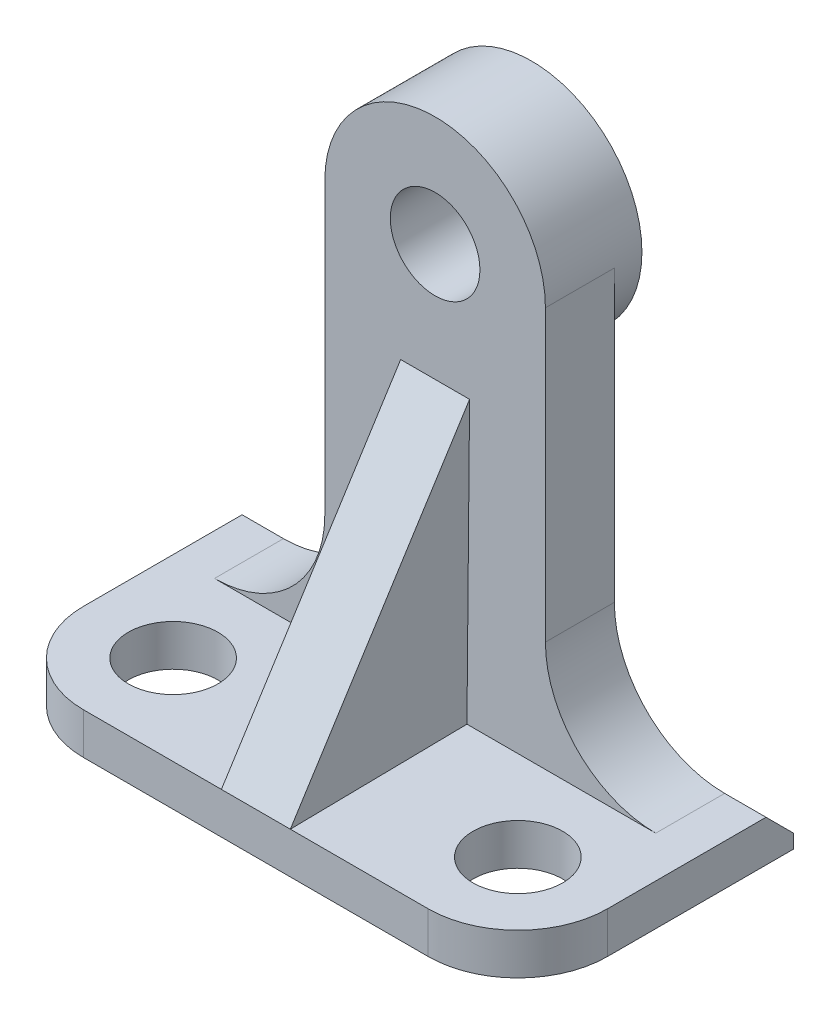
ISO-10303-21;
HEADER;
FILE_DESCRIPTION(('STEP AP214'),'2;1');
FILE_NAME('part.step','',(''),(''),'','','');
FILE_SCHEMA(('AUTOMOTIVE_DESIGN { 1 0 10303 214 1 1 1 1 }'));
ENDSEC;
DATA;
#1=APPLICATION_CONTEXT('core data for automotive mechanical design processes');
#2=APPLICATION_PROTOCOL_DEFINITION('international standard','automotive_design',2000,#1);
#3=PRODUCT_CONTEXT('',#1,'mechanical');
#4=PRODUCT('Part','Part','',(#3));
#5=PRODUCT_RELATED_PRODUCT_CATEGORY('part','',(#4));
#6=PRODUCT_DEFINITION_FORMATION('','',#4);
#7=PRODUCT_DEFINITION_CONTEXT('part definition',#1,'design');
#8=PRODUCT_DEFINITION('design','',#6,#7);
#9=PRODUCT_DEFINITION_SHAPE('','',#8);
#10=(LENGTH_UNIT() NAMED_UNIT(*) SI_UNIT(.MILLI.,.METRE.));
#11=(NAMED_UNIT(*) PLANE_ANGLE_UNIT() SI_UNIT($,.RADIAN.));
#12=(NAMED_UNIT(*) SI_UNIT($,.STERADIAN.) SOLID_ANGLE_UNIT());
#13=UNCERTAINTY_MEASURE_WITH_UNIT(LENGTH_MEASURE(1.E-05),#10,'distance_accuracy_value','');
#14=(GEOMETRIC_REPRESENTATION_CONTEXT(3) GLOBAL_UNCERTAINTY_ASSIGNED_CONTEXT((#13)) GLOBAL_UNIT_ASSIGNED_CONTEXT((#10,
#11,#12)) REPRESENTATION_CONTEXT('',''));
#15=CARTESIAN_POINT('',(0.,0.,0.));
#16=DIRECTION('',(0.,0.,1.));
#17=DIRECTION('',(1.,0.,0.));
#18=AXIS2_PLACEMENT_3D('',#15,#16,#17);
#19=CARTESIAN_POINT('',(25.,-64.,23.));
#20=DIRECTION('',(0.,1.,0.));
#21=DIRECTION('',(0.,0.,1.));
#22=AXIS2_PLACEMENT_3D('',#19,#20,#21);
#23=CYLINDRICAL_SURFACE('',#22,13.);
#24=DIRECTION('',(0.,-1.,0.));
#25=VECTOR('',#24,1.);
#26=CARTESIAN_POINT('',(38.,-64.,23.));
#27=LINE('',#26,#25);
#28=CARTESIAN_POINT('',(38.,-58.,23.));
#29=VERTEX_POINT('',#28);
#30=CARTESIAN_POINT('',(38.,-64.,23.));
#31=VERTEX_POINT('',#30);
#32=EDGE_CURVE('E291',#29,#31,#27,.T.);
#33=ORIENTED_EDGE('',*,*,#32,.F.);
#34=CARTESIAN_POINT('',(25.,-58.,23.));
#35=DIRECTION('',(0.,-1.,0.));
#36=DIRECTION('',(0.,0.,-1.));
#37=AXIS2_PLACEMENT_3D('',#34,#35,#36);
#38=CIRCLE('',#37,13.);
#39=CARTESIAN_POINT('',(25.,-58.,36.));
#40=VERTEX_POINT('',#39);
#41=EDGE_CURVE('E55',#40,#29,#38,.F.);
#42=ORIENTED_EDGE('',*,*,#41,.F.);
#43=DIRECTION('',(0.,-1.,0.));
#44=VECTOR('',#43,1.);
#45=CARTESIAN_POINT('',(25.,-64.,36.));
#46=LINE('',#45,#44);
#47=CARTESIAN_POINT('',(25.,-64.,36.));
#48=VERTEX_POINT('',#47);
#49=EDGE_CURVE('E294',#48,#40,#46,.F.);
#50=ORIENTED_EDGE('',*,*,#49,.F.);
#51=CARTESIAN_POINT('',(25.,-64.,23.));
#52=DIRECTION('',(0.,1.,0.));
#53=DIRECTION('',(0.,0.,1.));
#54=AXIS2_PLACEMENT_3D('',#51,#52,#53);
#55=CIRCLE('',#54,13.);
#56=EDGE_CURVE('E13',#31,#48,#55,.F.);
#57=ORIENTED_EDGE('',*,*,#56,.F.);
#58=EDGE_LOOP('',(#33,#42,#50,#57));
#59=FACE_BOUND('',#58,.T.);
#60=ADVANCED_FACE('F48',(#59),#23,.T.);
#61=CARTESIAN_POINT('',(-25.,-64.,23.));
#62=DIRECTION('',(0.,-1.,0.));
#63=DIRECTION('',(0.,0.,-1.));
#64=AXIS2_PLACEMENT_3D('',#61,#62,#63);
#65=CYLINDRICAL_SURFACE('',#64,13.);
#66=DIRECTION('',(0.,1.,0.));
#67=VECTOR('',#66,1.);
#68=CARTESIAN_POINT('',(-38.,-64.,23.));
#69=LINE('',#68,#67);
#70=CARTESIAN_POINT('',(-38.,-64.,23.));
#71=VERTEX_POINT('',#70);
#72=CARTESIAN_POINT('',(-38.,-58.,23.));
#73=VERTEX_POINT('',#72);
#74=EDGE_CURVE('E281',#71,#73,#69,.T.);
#75=ORIENTED_EDGE('',*,*,#74,.F.);
#76=CARTESIAN_POINT('',(-25.,-64.,23.));
#77=DIRECTION('',(0.,1.,0.));
#78=DIRECTION('',(0.,0.,1.));
#79=AXIS2_PLACEMENT_3D('',#76,#77,#78);
#80=CIRCLE('',#79,13.);
#81=CARTESIAN_POINT('',(-25.,-64.,36.));
#82=VERTEX_POINT('',#81);
#83=EDGE_CURVE('E287',#82,#71,#80,.F.);
#84=ORIENTED_EDGE('',*,*,#83,.F.);
#85=DIRECTION('',(0.,1.,0.));
#86=VECTOR('',#85,1.);
#87=CARTESIAN_POINT('',(-25.,-64.,36.));
#88=LINE('',#87,#86);
#89=CARTESIAN_POINT('',(-25.,-58.,36.));
#90=VERTEX_POINT('',#89);
#91=EDGE_CURVE('E284',#90,#82,#88,.F.);
#92=ORIENTED_EDGE('',*,*,#91,.F.);
#93=CARTESIAN_POINT('',(-25.,-58.,23.));
#94=DIRECTION('',(0.,-1.,0.));
#95=DIRECTION('',(0.,0.,-1.));
#96=AXIS2_PLACEMENT_3D('',#93,#94,#95);
#97=CIRCLE('',#96,13.);
#98=EDGE_CURVE('E289',#73,#90,#97,.F.);
#99=ORIENTED_EDGE('',*,*,#98,.F.);
#100=EDGE_LOOP('',(#75,#84,#92,#99));
#101=FACE_BOUND('',#100,.T.);
#102=ADVANCED_FACE('F368',(#101),#65,.T.);
#103=CARTESIAN_POINT('',(32.,-58.,10.));
#104=DIRECTION('',(0.,-1.,0.));
#105=DIRECTION('',(0.,0.,-1.));
#106=AXIS2_PLACEMENT_3D('',#103,#104,#105);
#107=PLANE('',#106);
#108=CARTESIAN_POINT('',(25.,-58.,23.));
#109=DIRECTION('',(0.,1.,0.));
#110=DIRECTION('',(0.,0.,1.));
#111=AXIS2_PLACEMENT_3D('',#108,#109,#110);
#112=CIRCLE('',#111,6.5);
#113=CARTESIAN_POINT('',(25.,-58.,29.5));
#114=VERTEX_POINT('',#113);
#115=EDGE_CURVE('E332',#114,#114,#112,.T.);
#116=ORIENTED_EDGE('',*,*,#115,.F.);
#117=EDGE_LOOP('',(#116));
#118=FACE_BOUND('',#117,.T.);
#119=DIRECTION('',(-1.,0.,0.));
#120=VECTOR('',#119,1.);
#121=CARTESIAN_POINT('',(38.,-58.,36.));
#122=LINE('',#121,#120);
#123=CARTESIAN_POINT('',(5.,-58.,36.));
#124=VERTEX_POINT('',#123);
#125=EDGE_CURVE('E191',#40,#124,#122,.T.);
#126=ORIENTED_EDGE('',*,*,#125,.F.);
#127=ORIENTED_EDGE('',*,*,#41,.T.);
#128=DIRECTION('',(0.,0.,-1.));
#129=VECTOR('',#128,1.);
#130=CARTESIAN_POINT('',(38.,-58.,10.));
#131=LINE('',#130,#129);
#132=CARTESIAN_POINT('',(38.,-58.,0.));
#133=VERTEX_POINT('',#132);
#134=EDGE_CURVE('E253',#29,#133,#131,.T.);
#135=ORIENTED_EDGE('',*,*,#134,.T.);
#136=DIRECTION('',(-1.,0.,0.));
#137=VECTOR('',#136,1.);
#138=CARTESIAN_POINT('',(-38.,-58.,0.));
#139=LINE('',#138,#137);
#140=CARTESIAN_POINT('',(32.,-58.,0.));
#141=VERTEX_POINT('',#140);
#142=EDGE_CURVE('E277',#133,#141,#139,.T.);
#143=ORIENTED_EDGE('',*,*,#142,.T.);
#144=DIRECTION('',(0.,0.,-1.));
#145=VECTOR('',#144,1.);
#146=CARTESIAN_POINT('',(32.,-58.,10.));
#147=LINE('',#146,#145);
#148=CARTESIAN_POINT('',(32.,-58.,10.));
#149=VERTEX_POINT('',#148);
#150=EDGE_CURVE('E250',#149,#141,#147,.T.);
#151=ORIENTED_EDGE('',*,*,#150,.F.);
#152=DIRECTION('',(1.,0.,0.));
#153=VECTOR('',#152,1.);
#154=CARTESIAN_POINT('',(0.,-58.,10.));
#155=LINE('',#154,#153);
#156=CARTESIAN_POINT('',(4.61673524619883,-58.,10.));
#157=VERTEX_POINT('',#156);
#158=EDGE_CURVE('E208',#157,#149,#155,.T.);
#159=ORIENTED_EDGE('',*,*,#158,.F.);
#160=DIRECTION('',(0.014739350757727,0.,0.999891369869368));
#161=VECTOR('',#160,1.);
#162=CARTESIAN_POINT('',(4.62268421831715,-58.,10.4035676997232));
#163=LINE('',#162,#161);
#164=EDGE_CURVE('E184',#157,#124,#163,.T.);
#165=ORIENTED_EDGE('',*,*,#164,.T.);
#166=EDGE_LOOP('',(#126,#127,#135,#143,#151,#159,#165));
#167=FACE_BOUND('',#166,.T.);
#168=ADVANCED_FACE('F297',(#118,#167),#107,.F.);
#169=CARTESIAN_POINT('',(0.,0.,10.));
#170=DIRECTION('',(0.,0.,1.));
#171=DIRECTION('',(1.,0.,0.));
#172=AXIS2_PLACEMENT_3D('',#169,#170,#171);
#173=PLANE('',#172);
#174=DIRECTION('',(0.00934751242358628,0.999956311051383,0.));
#175=VECTOR('',#174,1.);
#176=CARTESIAN_POINT('',(5.15846388874759,-0.0482209120076363,10.));
#177=LINE('',#176,#175);
#178=CARTESIAN_POINT('',(5.,-17.,10.));
#179=VERTEX_POINT('',#178);
#180=EDGE_CURVE('E169',#157,#179,#177,.T.);
#181=ORIENTED_EDGE('',*,*,#180,.F.);
#182=ORIENTED_EDGE('',*,*,#158,.T.);
#183=CARTESIAN_POINT('',(32.,-42.,10.));
#184=DIRECTION('',(0.,0.,-1.));
#185=DIRECTION('',(1.,0.,0.));
#186=AXIS2_PLACEMENT_3D('',#183,#184,#185);
#187=CIRCLE('',#186,16.);
#188=CARTESIAN_POINT('',(16.,-42.,10.));
#189=VERTEX_POINT('',#188);
#190=EDGE_CURVE('E232',#149,#189,#187,.T.);
#191=ORIENTED_EDGE('',*,*,#190,.T.);
#192=DIRECTION('',(0.,1.,0.));
#193=VECTOR('',#192,1.);
#194=CARTESIAN_POINT('',(16.,0.,10.));
#195=LINE('',#194,#193);
#196=CARTESIAN_POINT('',(16.,0.,10.));
#197=VERTEX_POINT('',#196);
#198=EDGE_CURVE('E234',#189,#197,#195,.T.);
#199=ORIENTED_EDGE('',*,*,#198,.T.);
#200=CARTESIAN_POINT('',(0.,0.,10.));
#201=DIRECTION('',(0.,0.,1.));
#202=DIRECTION('',(1.,0.,0.));
#203=AXIS2_PLACEMENT_3D('',#200,#201,#202);
#204=CIRCLE('',#203,16.);
#205=CARTESIAN_POINT('',(-16.,0.,10.));
#206=VERTEX_POINT('',#205);
#207=EDGE_CURVE('E224',#197,#206,#204,.T.);
#208=ORIENTED_EDGE('',*,*,#207,.T.);
#209=DIRECTION('',(0.,-1.,0.));
#210=VECTOR('',#209,1.);
#211=CARTESIAN_POINT('',(-16.,0.,10.));
#212=LINE('',#211,#210);
#213=CARTESIAN_POINT('',(-16.,-42.,10.));
#214=VERTEX_POINT('',#213);
#215=EDGE_CURVE('E227',#206,#214,#212,.T.);
#216=ORIENTED_EDGE('',*,*,#215,.T.);
#217=CARTESIAN_POINT('',(-32.,-42.,10.));
#218=DIRECTION('',(0.,0.,-1.));
#219=DIRECTION('',(1.,0.,0.));
#220=AXIS2_PLACEMENT_3D('',#217,#218,#219);
#221=CIRCLE('',#220,16.);
#222=CARTESIAN_POINT('',(-32.,-58.,10.));
#223=VERTEX_POINT('',#222);
#224=EDGE_CURVE('E230',#214,#223,#221,.T.);
#225=ORIENTED_EDGE('',*,*,#224,.T.);
#226=CARTESIAN_POINT('',(-4.61673524619882,-58.,10.));
#227=VERTEX_POINT('',#226);
#228=EDGE_CURVE('E183',#223,#227,#155,.T.);
#229=ORIENTED_EDGE('',*,*,#228,.T.);
#230=DIRECTION('',(-0.00934751242358628,0.999956311051383,0.));
#231=VECTOR('',#230,1.);
#232=CARTESIAN_POINT('',(-5.15846388874759,-0.0482209120076363,10.));
#233=LINE('',#232,#231);
#234=CARTESIAN_POINT('',(-5.,-17.,10.));
#235=VERTEX_POINT('',#234);
#236=EDGE_CURVE('E173',#227,#235,#233,.T.);
#237=ORIENTED_EDGE('',*,*,#236,.T.);
#238=DIRECTION('',(1.,0.,0.));
#239=VECTOR('',#238,1.);
#240=CARTESIAN_POINT('',(0.,-17.,10.));
#241=LINE('',#240,#239);
#242=EDGE_CURVE('E157',#179,#235,#241,.F.);
#243=ORIENTED_EDGE('',*,*,#242,.F.);
#244=EDGE_LOOP('',(#181,#182,#191,#199,#208,#216,#225,#229,#237,#243));
#245=FACE_BOUND('',#244,.T.);
#246=CARTESIAN_POINT('',(0.,0.,10.));
#247=DIRECTION('',(0.,0.,1.));
#248=DIRECTION('',(1.,0.,0.));
#249=AXIS2_PLACEMENT_3D('',#246,#247,#248);
#250=CIRCLE('',#249,6.5);
#251=CARTESIAN_POINT('',(6.5,0.,10.));
#252=VERTEX_POINT('',#251);
#253=EDGE_CURVE('E216',#252,#252,#250,.T.);
#254=ORIENTED_EDGE('',*,*,#253,.F.);
#255=EDGE_LOOP('',(#254));
#256=FACE_BOUND('',#255,.T.);
#257=ADVANCED_FACE('F180',(#245,#256),#173,.T.);
#258=CARTESIAN_POINT('',(0.,0.,0.));
#259=DIRECTION('',(0.,0.,1.));
#260=DIRECTION('',(1.,0.,0.));
#261=AXIS2_PLACEMENT_3D('',#258,#259,#260);
#262=PLANE('',#261);
#263=CARTESIAN_POINT('',(32.,-42.,0.));
#264=DIRECTION('',(0.,0.,-1.));
#265=DIRECTION('',(1.,0.,0.));
#266=AXIS2_PLACEMENT_3D('',#263,#264,#265);
#267=CIRCLE('',#266,16.);
#268=CARTESIAN_POINT('',(16.,-42.,0.));
#269=VERTEX_POINT('',#268);
#270=EDGE_CURVE('E241',#141,#269,#267,.T.);
#271=ORIENTED_EDGE('',*,*,#270,.F.);
#272=DIRECTION('',(1.,0.,0.));
#273=VECTOR('',#272,1.);
#274=CARTESIAN_POINT('',(0.,-58.,0.));
#275=LINE('',#274,#273);
#276=CARTESIAN_POINT('',(-32.,-58.,0.));
#277=VERTEX_POINT('',#276);
#278=EDGE_CURVE('E203',#277,#141,#275,.T.);
#279=ORIENTED_EDGE('',*,*,#278,.F.);
#280=CARTESIAN_POINT('',(-32.,-42.,0.));
#281=DIRECTION('',(0.,0.,-1.));
#282=DIRECTION('',(1.,0.,0.));
#283=AXIS2_PLACEMENT_3D('',#280,#281,#282);
#284=CIRCLE('',#283,16.);
#285=CARTESIAN_POINT('',(-16.,-42.,0.));
#286=VERTEX_POINT('',#285);
#287=EDGE_CURVE('E238',#286,#277,#284,.T.);
#288=ORIENTED_EDGE('',*,*,#287,.F.);
#289=DIRECTION('',(0.,-1.,0.));
#290=VECTOR('',#289,1.);
#291=CARTESIAN_POINT('',(-16.,0.,0.));
#292=LINE('',#291,#290);
#293=CARTESIAN_POINT('',(-16.,0.,0.));
#294=VERTEX_POINT('',#293);
#295=EDGE_CURVE('E223',#294,#286,#292,.T.);
#296=ORIENTED_EDGE('',*,*,#295,.F.);
#297=CARTESIAN_POINT('',(0.,0.,0.));
#298=DIRECTION('',(0.,0.,-1.));
#299=DIRECTION('',(-1.,0.,0.));
#300=AXIS2_PLACEMENT_3D('',#297,#298,#299);
#301=CIRCLE('',#300,16.);
#302=CARTESIAN_POINT('',(16.,0.,0.));
#303=VERTEX_POINT('',#302);
#304=EDGE_CURVE('E217',#303,#294,#301,.T.);
#305=ORIENTED_EDGE('',*,*,#304,.F.);
#306=DIRECTION('',(0.,1.,0.));
#307=VECTOR('',#306,1.);
#308=CARTESIAN_POINT('',(16.,0.,0.));
#309=LINE('',#308,#307);
#310=EDGE_CURVE('E228',#269,#303,#309,.T.);
#311=ORIENTED_EDGE('',*,*,#310,.F.);
#312=EDGE_LOOP('',(#271,#279,#288,#296,#305,#311));
#313=FACE_BOUND('',#312,.T.);
#314=ADVANCED_FACE('F316',(#313),#262,.F.);
#315=CARTESIAN_POINT('',(0.,0.,10.));
#316=DIRECTION('',(0.,0.,-1.));
#317=DIRECTION('',(-1.,0.,0.));
#318=AXIS2_PLACEMENT_3D('',#315,#316,#317);
#319=CYLINDRICAL_SURFACE('',#318,16.);
#320=CARTESIAN_POINT('',(0.,0.,-4.));
#321=DIRECTION('',(0.,0.,-1.));
#322=DIRECTION('',(-1.,0.,0.));
#323=AXIS2_PLACEMENT_3D('',#320,#321,#322);
#324=CIRCLE('',#323,16.);
#325=CARTESIAN_POINT('',(-16.,0.,-4.));
#326=VERTEX_POINT('',#325);
#327=EDGE_CURVE('E213',#326,#326,#324,.T.);
#328=ORIENTED_EDGE('',*,*,#327,.F.);
#329=EDGE_LOOP('',(#328));
#330=FACE_BOUND('',#329,.T.);
#331=ORIENTED_EDGE('',*,*,#304,.T.);
#332=DIRECTION('',(0.,0.,-1.));
#333=VECTOR('',#332,1.);
#334=CARTESIAN_POINT('',(-16.,0.,10.));
#335=LINE('',#334,#333);
#336=EDGE_CURVE('E220',#206,#294,#335,.T.);
#337=ORIENTED_EDGE('',*,*,#336,.F.);
#338=ORIENTED_EDGE('',*,*,#207,.F.);
#339=DIRECTION('',(0.,0.,-1.));
#340=VECTOR('',#339,1.);
#341=CARTESIAN_POINT('',(16.,0.,10.));
#342=LINE('',#341,#340);
#343=EDGE_CURVE('E236',#197,#303,#342,.T.);
#344=ORIENTED_EDGE('',*,*,#343,.T.);
#345=EDGE_LOOP('',(#331,#337,#338,#344));
#346=FACE_BOUND('',#345,.T.);
#347=ADVANCED_FACE('F325',(#330,#346),#319,.T.);
#348=CARTESIAN_POINT('',(-16.,0.,10.));
#349=DIRECTION('',(1.,0.,0.));
#350=DIRECTION('',(0.,1.,0.));
#351=AXIS2_PLACEMENT_3D('',#348,#349,#350);
#352=PLANE('',#351);
#353=ORIENTED_EDGE('',*,*,#295,.T.);
#354=DIRECTION('',(0.,0.,-1.));
#355=VECTOR('',#354,1.);
#356=CARTESIAN_POINT('',(-16.,-42.,10.));
#357=LINE('',#356,#355);
#358=EDGE_CURVE('E264',#214,#286,#357,.T.);
#359=ORIENTED_EDGE('',*,*,#358,.F.);
#360=ORIENTED_EDGE('',*,*,#215,.F.);
#361=ORIENTED_EDGE('',*,*,#336,.T.);
#362=EDGE_LOOP('',(#353,#359,#360,#361));
#363=FACE_BOUND('',#362,.T.);
#364=ADVANCED_FACE('F402',(#363),#352,.F.);
#365=CARTESIAN_POINT('',(-32.,-42.,10.));
#366=DIRECTION('',(0.,0.,-1.));
#367=DIRECTION('',(-1.,0.,0.));
#368=AXIS2_PLACEMENT_3D('',#365,#366,#367);
#369=CYLINDRICAL_SURFACE('',#368,16.);
#370=ORIENTED_EDGE('',*,*,#287,.T.);
#371=DIRECTION('',(0.,0.,-1.));
#372=VECTOR('',#371,1.);
#373=CARTESIAN_POINT('',(-32.,-58.,10.));
#374=LINE('',#373,#372);
#375=EDGE_CURVE('E261',#223,#277,#374,.T.);
#376=ORIENTED_EDGE('',*,*,#375,.F.);
#377=ORIENTED_EDGE('',*,*,#224,.F.);
#378=ORIENTED_EDGE('',*,*,#358,.T.);
#379=EDGE_LOOP('',(#370,#376,#377,#378));
#380=FACE_BOUND('',#379,.T.);
#381=ADVANCED_FACE('F387',(#380),#369,.F.);
#382=CARTESIAN_POINT('',(-38.,-64.,10.));
#383=DIRECTION('',(1.,0.,0.));
#384=DIRECTION('',(0.,0.,-1.));
#385=AXIS2_PLACEMENT_3D('',#382,#383,#384);
#386=PLANE('',#385);
#387=DIRECTION('',(0.,0.,-1.));
#388=VECTOR('',#387,1.);
#389=CARTESIAN_POINT('',(-38.,-64.,10.));
#390=LINE('',#389,#388);
#391=CARTESIAN_POINT('',(-38.,-64.,-4.));
#392=VERTEX_POINT('',#391);
#393=EDGE_CURVE('E257',#71,#392,#390,.T.);
#394=ORIENTED_EDGE('',*,*,#393,.F.);
#395=ORIENTED_EDGE('',*,*,#74,.T.);
#396=DIRECTION('',(0.,0.,-1.));
#397=VECTOR('',#396,1.);
#398=CARTESIAN_POINT('',(-38.,-58.,10.));
#399=LINE('',#398,#397);
#400=CARTESIAN_POINT('',(-38.,-58.,0.));
#401=VERTEX_POINT('',#400);
#402=EDGE_CURVE('E259',#73,#401,#399,.T.);
#403=ORIENTED_EDGE('',*,*,#402,.T.);
#404=DIRECTION('',(0.,-0.707106781186546,-0.707106781186549));
#405=VECTOR('',#404,1.);
#406=CARTESIAN_POINT('',(-38.,-62.,-4.));
#407=LINE('',#406,#405);
#408=CARTESIAN_POINT('',(-38.,-62.,-4.));
#409=VERTEX_POINT('',#408);
#410=EDGE_CURVE('E279',#401,#409,#407,.T.);
#411=ORIENTED_EDGE('',*,*,#410,.T.);
#412=DIRECTION('',(0.,-1.,0.));
#413=VECTOR('',#412,1.);
#414=CARTESIAN_POINT('',(-38.,-58.,-4.));
#415=LINE('',#414,#413);
#416=EDGE_CURVE('E193',#409,#392,#415,.T.);
#417=ORIENTED_EDGE('',*,*,#416,.T.);
#418=EDGE_LOOP('',(#394,#395,#403,#411,#417));
#419=FACE_BOUND('',#418,.T.);
#420=ADVANCED_FACE('F363',(#419),#386,.F.);
#421=CARTESIAN_POINT('',(-38.,-64.,10.));
#422=DIRECTION('',(0.,1.,0.));
#423=DIRECTION('',(0.,0.,1.));
#424=AXIS2_PLACEMENT_3D('',#421,#422,#423);
#425=PLANE('',#424);
#426=CARTESIAN_POINT('',(-25.,-64.,23.));
#427=DIRECTION('',(0.,1.,0.));
#428=DIRECTION('',(0.,0.,1.));
#429=AXIS2_PLACEMENT_3D('',#426,#427,#428);
#430=CIRCLE('',#429,6.5);
#431=CARTESIAN_POINT('',(-25.,-64.,29.5));
#432=VERTEX_POINT('',#431);
#433=EDGE_CURVE('E177',#432,#432,#430,.T.);
#434=ORIENTED_EDGE('',*,*,#433,.T.);
#435=EDGE_LOOP('',(#434));
#436=FACE_BOUND('',#435,.T.);
#437=CARTESIAN_POINT('',(25.,-64.,23.));
#438=DIRECTION('',(0.,1.,0.));
#439=DIRECTION('',(0.,0.,1.));
#440=AXIS2_PLACEMENT_3D('',#437,#438,#439);
#441=CIRCLE('',#440,6.5);
#442=CARTESIAN_POINT('',(25.,-64.,29.5));
#443=VERTEX_POINT('',#442);
#444=EDGE_CURVE('E335',#443,#443,#441,.T.);
#445=ORIENTED_EDGE('',*,*,#444,.T.);
#446=EDGE_LOOP('',(#445));
#447=FACE_BOUND('',#446,.T.);
#448=DIRECTION('',(0.,0.,-1.));
#449=VECTOR('',#448,1.);
#450=CARTESIAN_POINT('',(38.,-64.,10.));
#451=LINE('',#450,#449);
#452=CARTESIAN_POINT('',(38.,-64.,-4.));
#453=VERTEX_POINT('',#452);
#454=EDGE_CURVE('E255',#31,#453,#451,.T.);
#455=ORIENTED_EDGE('',*,*,#454,.F.);
#456=ORIENTED_EDGE('',*,*,#56,.T.);
#457=DIRECTION('',(-1.,0.,0.));
#458=VECTOR('',#457,1.);
#459=CARTESIAN_POINT('',(38.,-64.,36.));
#460=LINE('',#459,#458);
#461=EDGE_CURVE('E168',#48,#82,#460,.T.);
#462=ORIENTED_EDGE('',*,*,#461,.T.);
#463=ORIENTED_EDGE('',*,*,#83,.T.);
#464=ORIENTED_EDGE('',*,*,#393,.T.);
#465=DIRECTION('',(1.,0.,0.));
#466=VECTOR('',#465,1.);
#467=CARTESIAN_POINT('',(-38.,-64.,-4.));
#468=LINE('',#467,#466);
#469=EDGE_CURVE('E197',#392,#453,#468,.T.);
#470=ORIENTED_EDGE('',*,*,#469,.T.);
#471=EDGE_LOOP('',(#455,#456,#462,#463,#464,#470));
#472=FACE_BOUND('',#471,.T.);
#473=ADVANCED_FACE('F344',(#436,#447,#472),#425,.F.);
#474=CARTESIAN_POINT('',(38.,-64.,10.));
#475=DIRECTION('',(-1.,0.,0.));
#476=DIRECTION('',(0.,0.,1.));
#477=AXIS2_PLACEMENT_3D('',#474,#475,#476);
#478=PLANE('',#477);
#479=ORIENTED_EDGE('',*,*,#134,.F.);
#480=ORIENTED_EDGE('',*,*,#32,.T.);
#481=ORIENTED_EDGE('',*,*,#454,.T.);
#482=DIRECTION('',(0.,-1.,0.));
#483=VECTOR('',#482,1.);
#484=CARTESIAN_POINT('',(38.,-58.,-4.));
#485=LINE('',#484,#483);
#486=CARTESIAN_POINT('',(38.,-62.,-4.));
#487=VERTEX_POINT('',#486);
#488=EDGE_CURVE('E200',#487,#453,#485,.T.);
#489=ORIENTED_EDGE('',*,*,#488,.F.);
#490=DIRECTION('',(0.,0.707106781186546,0.707106781186549));
#491=VECTOR('',#490,1.);
#492=CARTESIAN_POINT('',(38.,-62.,-4.));
#493=LINE('',#492,#491);
#494=EDGE_CURVE('E271',#487,#133,#493,.T.);
#495=ORIENTED_EDGE('',*,*,#494,.T.);
#496=EDGE_LOOP('',(#479,#480,#481,#489,#495));
#497=FACE_BOUND('',#496,.T.);
#498=ADVANCED_FACE('F300',(#497),#478,.F.);
#499=CARTESIAN_POINT('',(-25.,-58.,23.));
#500=DIRECTION('',(0.,1.,0.));
#501=DIRECTION('',(0.,0.,1.));
#502=AXIS2_PLACEMENT_3D('',#499,#500,#501);
#503=CIRCLE('',#502,6.5);
#504=CARTESIAN_POINT('',(-25.,-58.,29.5));
#505=VERTEX_POINT('',#504);
#506=EDGE_CURVE('E338',#505,#505,#503,.T.);
#507=ORIENTED_EDGE('',*,*,#506,.F.);
#508=EDGE_LOOP('',(#507));
#509=FACE_BOUND('',#508,.T.);
#510=ORIENTED_EDGE('',*,*,#402,.F.);
#511=ORIENTED_EDGE('',*,*,#98,.T.);
#512=CARTESIAN_POINT('',(-5.,-58.,36.));
#513=VERTEX_POINT('',#512);
#514=EDGE_CURVE('E195',#513,#90,#122,.T.);
#515=ORIENTED_EDGE('',*,*,#514,.F.);
#516=DIRECTION('',(-0.014739350757727,0.,0.999891369869368));
#517=VECTOR('',#516,1.);
#518=CARTESIAN_POINT('',(-4.60878031682856,-58.,9.46035172403498));
#519=LINE('',#518,#517);
#520=EDGE_CURVE('E175',#227,#513,#519,.T.);
#521=ORIENTED_EDGE('',*,*,#520,.F.);
#522=ORIENTED_EDGE('',*,*,#228,.F.);
#523=ORIENTED_EDGE('',*,*,#375,.T.);
#524=DIRECTION('',(-1.,0.,0.));
#525=VECTOR('',#524,1.);
#526=CARTESIAN_POINT('',(-38.,-58.,0.));
#527=LINE('',#526,#525);
#528=EDGE_CURVE('E274',#277,#401,#527,.T.);
#529=ORIENTED_EDGE('',*,*,#528,.T.);
#530=EDGE_LOOP('',(#510,#511,#515,#521,#522,#523,#529));
#531=FACE_BOUND('',#530,.T.);
#532=ADVANCED_FACE('F354',(#509,#531),#107,.F.);
#533=CARTESIAN_POINT('',(32.,-42.,10.));
#534=DIRECTION('',(0.,0.,-1.));
#535=DIRECTION('',(-1.,0.,0.));
#536=AXIS2_PLACEMENT_3D('',#533,#534,#535);
#537=CYLINDRICAL_SURFACE('',#536,16.);
#538=ORIENTED_EDGE('',*,*,#270,.T.);
#539=DIRECTION('',(0.,0.,-1.));
#540=VECTOR('',#539,1.);
#541=CARTESIAN_POINT('',(16.,-42.,10.));
#542=LINE('',#541,#540);
#543=EDGE_CURVE('E247',#189,#269,#542,.T.);
#544=ORIENTED_EDGE('',*,*,#543,.F.);
#545=ORIENTED_EDGE('',*,*,#190,.F.);
#546=ORIENTED_EDGE('',*,*,#150,.T.);
#547=EDGE_LOOP('',(#538,#544,#545,#546));
#548=FACE_BOUND('',#547,.T.);
#549=ADVANCED_FACE('F312',(#548),#537,.F.);
#550=CARTESIAN_POINT('',(16.,0.,10.));
#551=DIRECTION('',(-1.,0.,0.));
#552=DIRECTION('',(0.,-1.,0.));
#553=AXIS2_PLACEMENT_3D('',#550,#551,#552);
#554=PLANE('',#553);
#555=ORIENTED_EDGE('',*,*,#310,.T.);
#556=ORIENTED_EDGE('',*,*,#343,.F.);
#557=ORIENTED_EDGE('',*,*,#198,.F.);
#558=ORIENTED_EDGE('',*,*,#543,.T.);
#559=EDGE_LOOP('',(#555,#556,#557,#558));
#560=FACE_BOUND('',#559,.T.);
#561=ADVANCED_FACE('F321',(#560),#554,.F.);
#562=CARTESIAN_POINT('',(0.,0.,10.));
#563=DIRECTION('',(0.,0.,-1.));
#564=DIRECTION('',(-1.,0.,0.));
#565=AXIS2_PLACEMENT_3D('',#562,#563,#564);
#566=CYLINDRICAL_SURFACE('',#565,6.5);
#567=CARTESIAN_POINT('',(0.,0.,-4.));
#568=DIRECTION('',(0.,0.,-1.));
#569=DIRECTION('',(-1.,0.,0.));
#570=AXIS2_PLACEMENT_3D('',#567,#568,#569);
#571=CIRCLE('',#570,6.5);
#572=CARTESIAN_POINT('',(-6.5,0.,-4.));
#573=VERTEX_POINT('',#572);
#574=EDGE_CURVE('E210',#573,#573,#571,.T.);
#575=ORIENTED_EDGE('',*,*,#574,.T.);
#576=EDGE_LOOP('',(#575));
#577=FACE_BOUND('',#576,.T.);
#578=ORIENTED_EDGE('',*,*,#253,.T.);
#579=EDGE_LOOP('',(#578));
#580=FACE_BOUND('',#579,.T.);
#581=ADVANCED_FACE('F498',(#577,#580),#566,.F.);
#582=CARTESIAN_POINT('',(0.,0.,-4.));
#583=DIRECTION('',(0.,0.,-1.));
#584=DIRECTION('',(-1.,0.,0.));
#585=AXIS2_PLACEMENT_3D('',#582,#583,#584);
#586=PLANE('',#585);
#587=ORIENTED_EDGE('',*,*,#574,.F.);
#588=EDGE_LOOP('',(#587));
#589=FACE_BOUND('',#588,.T.);
#590=ORIENTED_EDGE('',*,*,#327,.T.);
#591=EDGE_LOOP('',(#590));
#592=FACE_BOUND('',#591,.T.);
#593=ADVANCED_FACE('F494',(#589,#592),#586,.T.);
#594=CARTESIAN_POINT('',(-38.,-58.,-4.));
#595=DIRECTION('',(0.,0.,-1.));
#596=DIRECTION('',(-1.,0.,0.));
#597=AXIS2_PLACEMENT_3D('',#594,#595,#596);
#598=PLANE('',#597);
#599=ORIENTED_EDGE('',*,*,#416,.F.);
#600=DIRECTION('',(1.,0.,0.));
#601=VECTOR('',#600,1.);
#602=CARTESIAN_POINT('',(38.,-62.,-4.));
#603=LINE('',#602,#601);
#604=EDGE_CURVE('E219',#409,#487,#603,.T.);
#605=ORIENTED_EDGE('',*,*,#604,.T.);
#606=ORIENTED_EDGE('',*,*,#488,.T.);
#607=ORIENTED_EDGE('',*,*,#469,.F.);
#608=EDGE_LOOP('',(#599,#605,#606,#607));
#609=FACE_BOUND('',#608,.T.);
#610=ADVANCED_FACE('F378',(#609),#598,.T.);
#611=CARTESIAN_POINT('',(38.,-58.,36.));
#612=DIRECTION('',(0.,0.,1.));
#613=DIRECTION('',(1.,0.,0.));
#614=AXIS2_PLACEMENT_3D('',#611,#612,#613);
#615=PLANE('',#614);
#616=ORIENTED_EDGE('',*,*,#461,.F.);
#617=ORIENTED_EDGE('',*,*,#49,.T.);
#618=ORIENTED_EDGE('',*,*,#125,.T.);
#619=EDGE_CURVE('E194',#124,#513,#122,.T.);
#620=ORIENTED_EDGE('',*,*,#619,.T.);
#621=ORIENTED_EDGE('',*,*,#514,.T.);
#622=ORIENTED_EDGE('',*,*,#91,.T.);
#623=EDGE_LOOP('',(#616,#617,#618,#620,#621,#622));
#624=FACE_BOUND('',#623,.T.);
#625=ADVANCED_FACE('F373',(#624),#615,.T.);
#626=CARTESIAN_POINT('',(0.,-58.,36.));
#627=DIRECTION('',(0.,-0.535542025358332,-0.844508578449678));
#628=DIRECTION('',(0.,0.844508578449678,-0.535542025358332));
#629=AXIS2_PLACEMENT_3D('',#626,#627,#628);
#630=PLANE('',#629);
#631=DIRECTION('',(0.,-0.844508578449678,0.535542025358332));
#632=VECTOR('',#631,1.);
#633=CARTESIAN_POINT('',(5.,-58.,36.));
#634=LINE('',#633,#632);
#635=EDGE_CURVE('E164',#124,#179,#634,.F.);
#636=ORIENTED_EDGE('',*,*,#635,.T.);
#637=ORIENTED_EDGE('',*,*,#242,.T.);
#638=DIRECTION('',(0.,0.844508578449678,-0.535542025358332));
#639=VECTOR('',#638,1.);
#640=CARTESIAN_POINT('',(-5.,-24.7059821807382,14.8867204072974));
#641=LINE('',#640,#639);
#642=EDGE_CURVE('E161',#513,#235,#641,.T.);
#643=ORIENTED_EDGE('',*,*,#642,.F.);
#644=ORIENTED_EDGE('',*,*,#619,.F.);
#645=EDGE_LOOP('',(#636,#637,#643,#644));
#646=FACE_BOUND('',#645,.T.);
#647=ADVANCED_FACE('F159',(#646),#630,.F.);
#648=CARTESIAN_POINT('',(5.,-24.7059821807382,14.8867204072974));
#649=DIRECTION('',(0.999847695156391,-0.00934649709079963,-0.0147387069508763));
#650=DIRECTION('',(-0.014739350757727,0.,-0.999891369869368));
#651=AXIS2_PLACEMENT_3D('',#648,#649,#650);
#652=PLANE('',#651);
#653=ORIENTED_EDGE('',*,*,#164,.F.);
#654=ORIENTED_EDGE('',*,*,#180,.T.);
#655=ORIENTED_EDGE('',*,*,#635,.F.);
#656=EDGE_LOOP('',(#653,#654,#655));
#657=FACE_BOUND('',#656,.T.);
#658=ADVANCED_FACE('F329',(#657),#652,.T.);
#659=CARTESIAN_POINT('',(-5.,-24.7059821807382,14.8867204072974));
#660=DIRECTION('',(0.999847695156391,0.00934649709079963,0.0147387069508763));
#661=DIRECTION('',(0.014739350757727,0.,-0.999891369869368));
#662=AXIS2_PLACEMENT_3D('',#659,#660,#661);
#663=PLANE('',#662);
#664=ORIENTED_EDGE('',*,*,#236,.F.);
#665=ORIENTED_EDGE('',*,*,#520,.T.);
#666=ORIENTED_EDGE('',*,*,#642,.T.);
#667=EDGE_LOOP('',(#664,#665,#666));
#668=FACE_BOUND('',#667,.T.);
#669=ADVANCED_FACE('F172',(#668),#663,.F.);
#670=CARTESIAN_POINT('',(-38.,-62.,-4.));
#671=DIRECTION('',(0.,0.707106781186549,-0.707106781186546));
#672=DIRECTION('',(-1.,0.,0.));
#673=AXIS2_PLACEMENT_3D('',#670,#671,#672);
#674=PLANE('',#673);
#675=ORIENTED_EDGE('',*,*,#278,.T.);
#676=ORIENTED_EDGE('',*,*,#142,.F.);
#677=ORIENTED_EDGE('',*,*,#494,.F.);
#678=ORIENTED_EDGE('',*,*,#604,.F.);
#679=ORIENTED_EDGE('',*,*,#410,.F.);
#680=ORIENTED_EDGE('',*,*,#528,.F.);
#681=EDGE_LOOP('',(#675,#676,#677,#678,#679,#680));
#682=FACE_BOUND('',#681,.T.);
#683=ADVANCED_FACE('F305',(#682),#674,.T.);
#684=CARTESIAN_POINT('',(-25.,-64.,23.));
#685=DIRECTION('',(0.,1.,0.));
#686=DIRECTION('',(0.,0.,1.));
#687=AXIS2_PLACEMENT_3D('',#684,#685,#686);
#688=CYLINDRICAL_SURFACE('',#687,6.5);
#689=ORIENTED_EDGE('',*,*,#433,.F.);
#690=EDGE_LOOP('',(#689));
#691=FACE_BOUND('',#690,.T.);
#692=ORIENTED_EDGE('',*,*,#506,.T.);
#693=EDGE_LOOP('',(#692));
#694=FACE_BOUND('',#693,.T.);
#695=ADVANCED_FACE('F347',(#691,#694),#688,.F.);
#696=CARTESIAN_POINT('',(25.,-64.,23.));
#697=DIRECTION('',(0.,1.,0.));
#698=DIRECTION('',(0.,0.,1.));
#699=AXIS2_PLACEMENT_3D('',#696,#697,#698);
#700=CYLINDRICAL_SURFACE('',#699,6.5);
#701=ORIENTED_EDGE('',*,*,#444,.F.);
#702=EDGE_LOOP('',(#701));
#703=FACE_BOUND('',#702,.T.);
#704=ORIENTED_EDGE('',*,*,#115,.T.);
#705=EDGE_LOOP('',(#704));
#706=FACE_BOUND('',#705,.T.);
#707=ADVANCED_FACE('F350',(#703,#706),#700,.F.);
#708=CLOSED_SHELL('',(#60,#102,#168,#257,#314,#347,#364,#381,#420,#473,#498,#532,#549,#561,#581,
#593,#610,#625,#647,#658,#669,#683,#695,#707));
#709=MANIFOLD_SOLID_BREP('B2',#708);
#710=ADVANCED_BREP_SHAPE_REPRESENTATION('',(#18,#709),#14);
#711=SHAPE_DEFINITION_REPRESENTATION(#9,#710);
ENDSEC;
END-ISO-10303-21;
